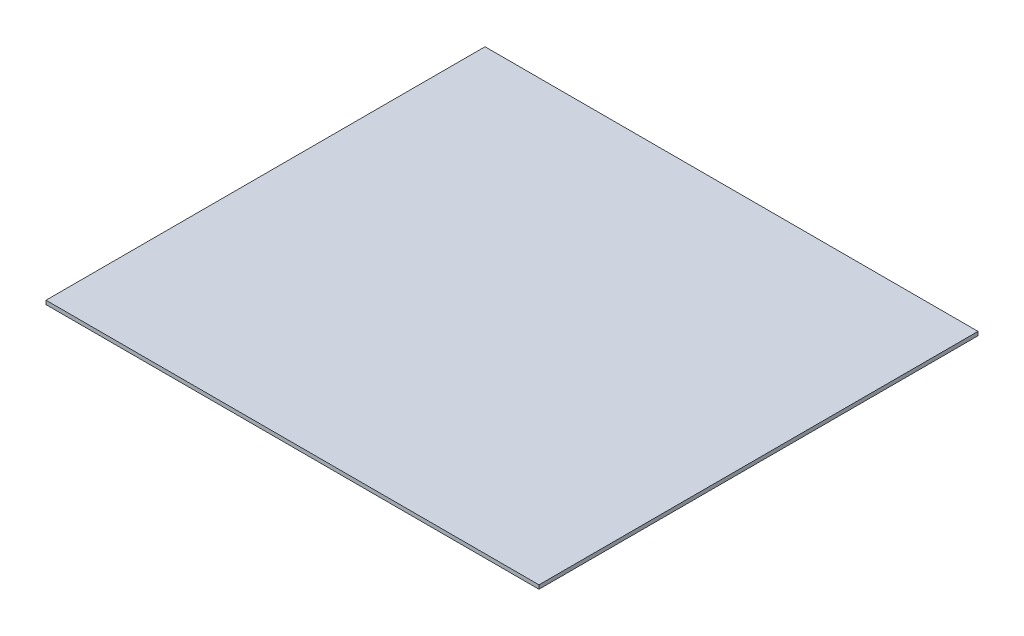
ISO-10303-21;
HEADER;
FILE_DESCRIPTION(('STEP AP214'),'2;1');
FILE_NAME('part.step','',(''),(''),'','','');
FILE_SCHEMA(('AUTOMOTIVE_DESIGN { 1 0 10303 214 1 1 1 1 }'));
ENDSEC;
DATA;
#1=APPLICATION_CONTEXT('core data for automotive mechanical design processes');
#2=APPLICATION_PROTOCOL_DEFINITION('international standard','automotive_design',2000,#1);
#3=PRODUCT_CONTEXT('',#1,'mechanical');
#4=PRODUCT('Part','Part','',(#3));
#5=PRODUCT_RELATED_PRODUCT_CATEGORY('part','',(#4));
#6=PRODUCT_DEFINITION_FORMATION('','',#4);
#7=PRODUCT_DEFINITION_CONTEXT('part definition',#1,'design');
#8=PRODUCT_DEFINITION('design','',#6,#7);
#9=PRODUCT_DEFINITION_SHAPE('','',#8);
#10=(LENGTH_UNIT() NAMED_UNIT(*) SI_UNIT(.MILLI.,.METRE.));
#11=(NAMED_UNIT(*) PLANE_ANGLE_UNIT() SI_UNIT($,.RADIAN.));
#12=(NAMED_UNIT(*) SI_UNIT($,.STERADIAN.) SOLID_ANGLE_UNIT());
#13=UNCERTAINTY_MEASURE_WITH_UNIT(LENGTH_MEASURE(1.E-05),#10,'distance_accuracy_value','');
#14=(GEOMETRIC_REPRESENTATION_CONTEXT(3) GLOBAL_UNCERTAINTY_ASSIGNED_CONTEXT((#13)) GLOBAL_UNIT_ASSIGNED_CONTEXT((#10,
#11,#12)) REPRESENTATION_CONTEXT('',''));
#15=CARTESIAN_POINT('',(0.,0.,0.));
#16=DIRECTION('',(0.,0.,1.));
#17=DIRECTION('',(1.,0.,0.));
#18=AXIS2_PLACEMENT_3D('',#15,#16,#17);
#19=CARTESIAN_POINT('',(64.175,0.999999999999997,57.15));
#20=DIRECTION('',(-1.,0.,0.));
#21=DIRECTION('',(0.,0.,1.));
#22=AXIS2_PLACEMENT_3D('',#19,#20,#21);
#23=PLANE('',#22);
#24=DIRECTION('',(0.,0.,-1.));
#25=VECTOR('',#24,1.);
#26=CARTESIAN_POINT('',(64.175,0.,57.15));
#27=LINE('',#26,#25);
#28=CARTESIAN_POINT('',(64.175,0.,57.15));
#29=VERTEX_POINT('',#28);
#30=CARTESIAN_POINT('',(64.175,0.,-57.15));
#31=VERTEX_POINT('',#30);
#32=EDGE_CURVE('E111',#29,#31,#27,.T.);
#33=ORIENTED_EDGE('',*,*,#32,.T.);
#34=DIRECTION('',(0.,-1.,0.));
#35=VECTOR('',#34,1.);
#36=CARTESIAN_POINT('',(64.175,0.999999999999997,-57.15));
#37=LINE('',#36,#35);
#38=CARTESIAN_POINT('',(64.175,0.999999999999997,-57.15));
#39=VERTEX_POINT('',#38);
#40=EDGE_CURVE('E11',#39,#31,#37,.T.);
#41=ORIENTED_EDGE('',*,*,#40,.F.);
#42=DIRECTION('',(0.,0.,-1.));
#43=VECTOR('',#42,1.);
#44=CARTESIAN_POINT('',(64.175,0.999999999999997,57.15));
#45=LINE('',#44,#43);
#46=CARTESIAN_POINT('',(64.175,0.999999999999997,57.15));
#47=VERTEX_POINT('',#46);
#48=EDGE_CURVE('E95',#47,#39,#45,.T.);
#49=ORIENTED_EDGE('',*,*,#48,.F.);
#50=DIRECTION('',(0.,-1.,0.));
#51=VECTOR('',#50,1.);
#52=CARTESIAN_POINT('',(64.175,0.999999999999997,57.15));
#53=LINE('',#52,#51);
#54=EDGE_CURVE('E107',#47,#29,#53,.T.);
#55=ORIENTED_EDGE('',*,*,#54,.T.);
#56=EDGE_LOOP('',(#33,#41,#49,#55));
#57=FACE_BOUND('',#56,.T.);
#58=ADVANCED_FACE('F43',(#57),#23,.F.);
#59=CARTESIAN_POINT('',(-64.175,0.999999999999997,-57.15));
#60=DIRECTION('',(0.,0.,1.));
#61=DIRECTION('',(1.,0.,0.));
#62=AXIS2_PLACEMENT_3D('',#59,#60,#61);
#63=PLANE('',#62);
#64=DIRECTION('',(-1.,0.,0.));
#65=VECTOR('',#64,1.);
#66=CARTESIAN_POINT('',(-64.175,0.,-57.15));
#67=LINE('',#66,#65);
#68=CARTESIAN_POINT('',(-64.175,0.,-57.15));
#69=VERTEX_POINT('',#68);
#70=EDGE_CURVE('E100',#31,#69,#67,.T.);
#71=ORIENTED_EDGE('',*,*,#70,.T.);
#72=DIRECTION('',(0.,-1.,0.));
#73=VECTOR('',#72,1.);
#74=CARTESIAN_POINT('',(-64.175,0.999999999999997,-57.15));
#75=LINE('',#74,#73);
#76=CARTESIAN_POINT('',(-64.175,0.999999999999997,-57.15));
#77=VERTEX_POINT('',#76);
#78=EDGE_CURVE('E52',#77,#69,#75,.T.);
#79=ORIENTED_EDGE('',*,*,#78,.F.);
#80=DIRECTION('',(-1.,0.,0.));
#81=VECTOR('',#80,1.);
#82=CARTESIAN_POINT('',(-64.175,0.999999999999997,-57.15));
#83=LINE('',#82,#81);
#84=EDGE_CURVE('E90',#39,#77,#83,.T.);
#85=ORIENTED_EDGE('',*,*,#84,.F.);
#86=ORIENTED_EDGE('',*,*,#40,.T.);
#87=EDGE_LOOP('',(#71,#79,#85,#86));
#88=FACE_BOUND('',#87,.T.);
#89=ADVANCED_FACE('F99',(#88),#63,.F.);
#90=CARTESIAN_POINT('',(-64.175,0.999999999999997,57.15));
#91=DIRECTION('',(1.,0.,0.));
#92=DIRECTION('',(0.,0.,-1.));
#93=AXIS2_PLACEMENT_3D('',#90,#91,#92);
#94=PLANE('',#93);
#95=DIRECTION('',(0.,0.,1.));
#96=VECTOR('',#95,1.);
#97=CARTESIAN_POINT('',(-64.175,0.,57.15));
#98=LINE('',#97,#96);
#99=CARTESIAN_POINT('',(-64.175,0.,57.15));
#100=VERTEX_POINT('',#99);
#101=EDGE_CURVE('E77',#69,#100,#98,.T.);
#102=ORIENTED_EDGE('',*,*,#101,.T.);
#103=DIRECTION('',(0.,-1.,0.));
#104=VECTOR('',#103,1.);
#105=CARTESIAN_POINT('',(-64.175,0.999999999999997,57.15));
#106=LINE('',#105,#104);
#107=CARTESIAN_POINT('',(-64.175,0.999999999999997,57.15));
#108=VERTEX_POINT('',#107);
#109=EDGE_CURVE('E102',#108,#100,#106,.T.);
#110=ORIENTED_EDGE('',*,*,#109,.F.);
#111=DIRECTION('',(0.,0.,1.));
#112=VECTOR('',#111,1.);
#113=CARTESIAN_POINT('',(-64.175,0.999999999999997,57.15));
#114=LINE('',#113,#112);
#115=EDGE_CURVE('E93',#77,#108,#114,.T.);
#116=ORIENTED_EDGE('',*,*,#115,.F.);
#117=ORIENTED_EDGE('',*,*,#78,.T.);
#118=EDGE_LOOP('',(#102,#110,#116,#117));
#119=FACE_BOUND('',#118,.T.);
#120=ADVANCED_FACE('F103',(#119),#94,.F.);
#121=CARTESIAN_POINT('',(-64.175,0.999999999999997,57.15));
#122=DIRECTION('',(0.,0.,-1.));
#123=DIRECTION('',(-1.,0.,0.));
#124=AXIS2_PLACEMENT_3D('',#121,#122,#123);
#125=PLANE('',#124);
#126=DIRECTION('',(1.,0.,0.));
#127=VECTOR('',#126,1.);
#128=CARTESIAN_POINT('',(-64.175,0.,57.15));
#129=LINE('',#128,#127);
#130=EDGE_CURVE('E83',#100,#29,#129,.T.);
#131=ORIENTED_EDGE('',*,*,#130,.T.);
#132=ORIENTED_EDGE('',*,*,#54,.F.);
#133=DIRECTION('',(1.,0.,0.));
#134=VECTOR('',#133,1.);
#135=CARTESIAN_POINT('',(-64.175,0.999999999999997,57.15));
#136=LINE('',#135,#134);
#137=EDGE_CURVE('E60',#108,#47,#136,.T.);
#138=ORIENTED_EDGE('',*,*,#137,.F.);
#139=ORIENTED_EDGE('',*,*,#109,.T.);
#140=EDGE_LOOP('',(#131,#132,#138,#139));
#141=FACE_BOUND('',#140,.T.);
#142=ADVANCED_FACE('F124',(#141),#125,.F.);
#143=CARTESIAN_POINT('',(0.,0.999999999999997,0.));
#144=DIRECTION('',(0.,-1.,0.));
#145=DIRECTION('',(0.,0.,-1.));
#146=AXIS2_PLACEMENT_3D('',#143,#144,#145);
#147=PLANE('',#146);
#148=ORIENTED_EDGE('',*,*,#48,.T.);
#149=ORIENTED_EDGE('',*,*,#84,.T.);
#150=ORIENTED_EDGE('',*,*,#115,.T.);
#151=ORIENTED_EDGE('',*,*,#137,.T.);
#152=EDGE_LOOP('',(#148,#149,#150,#151));
#153=FACE_BOUND('',#152,.T.);
#154=ADVANCED_FACE('F91',(#153),#147,.F.);
#155=CARTESIAN_POINT('',(0.,0.,0.));
#156=DIRECTION('',(0.,-1.,0.));
#157=DIRECTION('',(0.,0.,-1.));
#158=AXIS2_PLACEMENT_3D('',#155,#156,#157);
#159=PLANE('',#158);
#160=ORIENTED_EDGE('',*,*,#32,.F.);
#161=ORIENTED_EDGE('',*,*,#130,.F.);
#162=ORIENTED_EDGE('',*,*,#101,.F.);
#163=ORIENTED_EDGE('',*,*,#70,.F.);
#164=EDGE_LOOP('',(#160,#161,#162,#163));
#165=FACE_BOUND('',#164,.T.);
#166=ADVANCED_FACE('F127',(#165),#159,.T.);
#167=CLOSED_SHELL('',(#58,#89,#120,#142,#154,#166));
#168=MANIFOLD_SOLID_BREP('B2',#167);
#169=ADVANCED_BREP_SHAPE_REPRESENTATION('',(#18,#168),#14);
#170=SHAPE_DEFINITION_REPRESENTATION(#9,#169);
ENDSEC;
END-ISO-10303-21;
